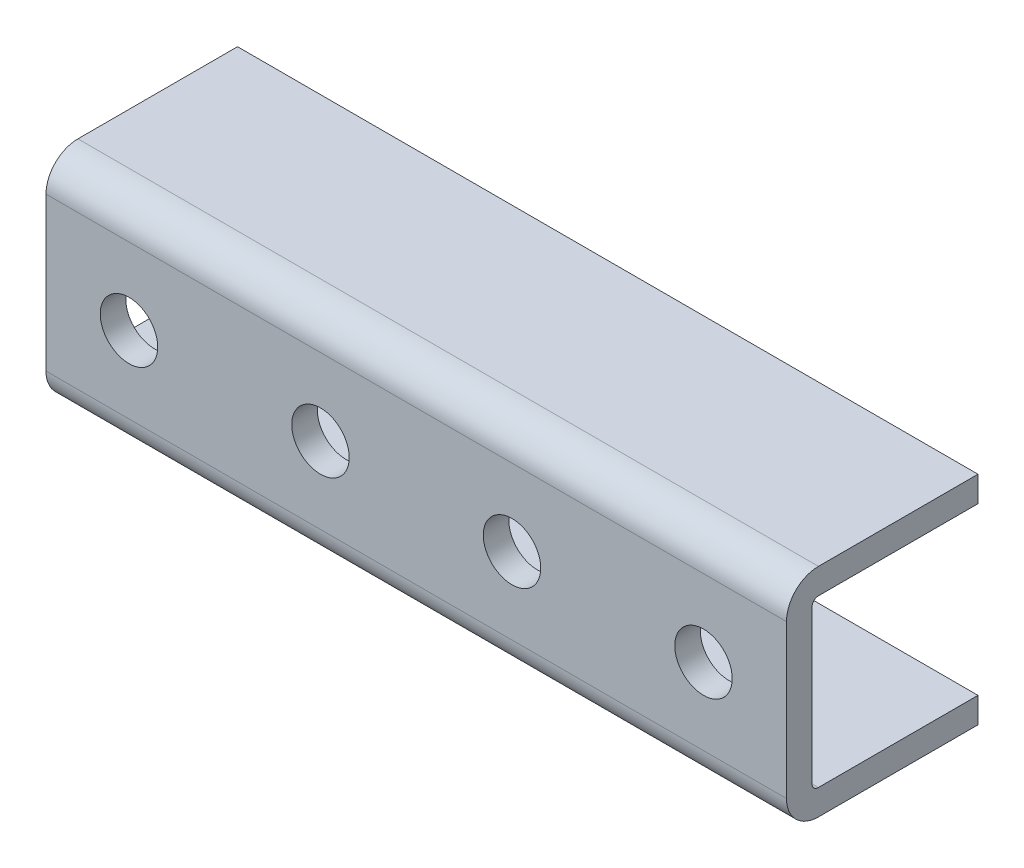
ISO-10303-21;
HEADER;
FILE_DESCRIPTION(('STEP AP214'),'2;1');
FILE_NAME('part.step','',(''),(''),'','','');
FILE_SCHEMA(('AUTOMOTIVE_DESIGN { 1 0 10303 214 1 1 1 1 }'));
ENDSEC;
DATA;
#1=APPLICATION_CONTEXT('core data for automotive mechanical design processes');
#2=APPLICATION_PROTOCOL_DEFINITION('international standard','automotive_design',2000,#1);
#3=PRODUCT_CONTEXT('',#1,'mechanical');
#4=PRODUCT('Part','Part','',(#3));
#5=PRODUCT_RELATED_PRODUCT_CATEGORY('part','',(#4));
#6=PRODUCT_DEFINITION_FORMATION('','',#4);
#7=PRODUCT_DEFINITION_CONTEXT('part definition',#1,'design');
#8=PRODUCT_DEFINITION('design','',#6,#7);
#9=PRODUCT_DEFINITION_SHAPE('','',#8);
#10=(LENGTH_UNIT() NAMED_UNIT(*) SI_UNIT(.MILLI.,.METRE.));
#11=(NAMED_UNIT(*) PLANE_ANGLE_UNIT() SI_UNIT($,.RADIAN.));
#12=(NAMED_UNIT(*) SI_UNIT($,.STERADIAN.) SOLID_ANGLE_UNIT());
#13=UNCERTAINTY_MEASURE_WITH_UNIT(LENGTH_MEASURE(1.E-05),#10,'distance_accuracy_value','');
#14=(GEOMETRIC_REPRESENTATION_CONTEXT(3) GLOBAL_UNCERTAINTY_ASSIGNED_CONTEXT((#13)) GLOBAL_UNIT_ASSIGNED_CONTEXT((#10,
#11,#12)) REPRESENTATION_CONTEXT('',''));
#15=CARTESIAN_POINT('',(0.,0.,0.));
#16=DIRECTION('',(0.,0.,1.));
#17=DIRECTION('',(1.,0.,0.));
#18=AXIS2_PLACEMENT_3D('',#15,#16,#17);
#19=CARTESIAN_POINT('',(92.075,26.9875,23.8125));
#20=DIRECTION('',(-1.,0.,0.));
#21=DIRECTION('',(0.,0.,1.));
#22=AXIS2_PLACEMENT_3D('',#19,#20,#21);
#23=PLANE('',#22);
#24=DIRECTION('',(0.,0.,-1.));
#25=VECTOR('',#24,1.);
#26=CARTESIAN_POINT('',(92.075,-20.6375,23.8125));
#27=LINE('',#26,#25);
#28=CARTESIAN_POINT('',(92.075,-20.6375,15.875));
#29=VERTEX_POINT('',#28);
#30=CARTESIAN_POINT('',(92.075,-20.6375,-23.8125));
#31=VERTEX_POINT('',#30);
#32=EDGE_CURVE('E49',#29,#31,#27,.T.);
#33=ORIENTED_EDGE('',*,*,#32,.F.);
#34=CARTESIAN_POINT('',(92.075,-19.05,15.875));
#35=DIRECTION('',(-1.,0.,0.));
#36=DIRECTION('',(0.,0.,1.));
#37=AXIS2_PLACEMENT_3D('',#34,#35,#36);
#38=CIRCLE('',#37,1.5875);
#39=CARTESIAN_POINT('',(92.075,-19.05,17.4625));
#40=VERTEX_POINT('',#39);
#41=EDGE_CURVE('E211',#40,#29,#38,.F.);
#42=ORIENTED_EDGE('',*,*,#41,.F.);
#43=DIRECTION('',(0.,1.,0.));
#44=VECTOR('',#43,1.);
#45=CARTESIAN_POINT('',(92.075,26.9875,17.4625));
#46=LINE('',#45,#44);
#47=CARTESIAN_POINT('',(92.075,19.05,17.4625));
#48=VERTEX_POINT('',#47);
#49=EDGE_CURVE('E221',#40,#48,#46,.T.);
#50=ORIENTED_EDGE('',*,*,#49,.T.);
#51=CARTESIAN_POINT('',(92.075,19.05,15.875));
#52=DIRECTION('',(-1.,0.,0.));
#53=DIRECTION('',(0.,0.,1.));
#54=AXIS2_PLACEMENT_3D('',#51,#52,#53);
#55=CIRCLE('',#54,1.5875);
#56=CARTESIAN_POINT('',(92.075,20.6375,15.875));
#57=VERTEX_POINT('',#56);
#58=EDGE_CURVE('E214',#57,#48,#55,.F.);
#59=ORIENTED_EDGE('',*,*,#58,.F.);
#60=DIRECTION('',(0.,0.,-1.));
#61=VECTOR('',#60,1.);
#62=CARTESIAN_POINT('',(92.075,20.6375,23.8125));
#63=LINE('',#62,#61);
#64=CARTESIAN_POINT('',(92.075,20.6375,-23.8125));
#65=VERTEX_POINT('',#64);
#66=EDGE_CURVE('E216',#57,#65,#63,.T.);
#67=ORIENTED_EDGE('',*,*,#66,.T.);
#68=DIRECTION('',(0.,1.,0.));
#69=VECTOR('',#68,1.);
#70=CARTESIAN_POINT('',(92.075,26.9875,-23.8125));
#71=LINE('',#70,#69);
#72=CARTESIAN_POINT('',(92.075,26.9875,-23.8125));
#73=VERTEX_POINT('',#72);
#74=EDGE_CURVE('E155',#65,#73,#71,.T.);
#75=ORIENTED_EDGE('',*,*,#74,.T.);
#76=DIRECTION('',(0.,0.,-1.));
#77=VECTOR('',#76,1.);
#78=CARTESIAN_POINT('',(92.075,26.9875,23.8125));
#79=LINE('',#78,#77);
#80=CARTESIAN_POINT('',(92.075,26.9875,15.875));
#81=VERTEX_POINT('',#80);
#82=EDGE_CURVE('E164',#81,#73,#79,.T.);
#83=ORIENTED_EDGE('',*,*,#82,.F.);
#84=CARTESIAN_POINT('',(92.075,19.05,15.875));
#85=DIRECTION('',(-1.,0.,0.));
#86=DIRECTION('',(0.,0.,1.));
#87=AXIS2_PLACEMENT_3D('',#84,#85,#86);
#88=CIRCLE('',#87,7.9375);
#89=CARTESIAN_POINT('',(92.075,19.05,23.8125));
#90=VERTEX_POINT('',#89);
#91=EDGE_CURVE('E177',#81,#90,#88,.F.);
#92=ORIENTED_EDGE('',*,*,#91,.T.);
#93=DIRECTION('',(0.,1.,0.));
#94=VECTOR('',#93,1.);
#95=CARTESIAN_POINT('',(92.075,26.9875,23.8125));
#96=LINE('',#95,#94);
#97=CARTESIAN_POINT('',(92.075,-19.05,23.8125));
#98=VERTEX_POINT('',#97);
#99=EDGE_CURVE('E152',#98,#90,#96,.T.);
#100=ORIENTED_EDGE('',*,*,#99,.F.);
#101=CARTESIAN_POINT('',(92.075,-19.05,15.875));
#102=DIRECTION('',(-1.,0.,0.));
#103=DIRECTION('',(0.,0.,1.));
#104=AXIS2_PLACEMENT_3D('',#101,#102,#103);
#105=CIRCLE('',#104,7.9375);
#106=CARTESIAN_POINT('',(92.075,-26.9875,15.875));
#107=VERTEX_POINT('',#106);
#108=EDGE_CURVE('E179',#98,#107,#105,.F.);
#109=ORIENTED_EDGE('',*,*,#108,.T.);
#110=DIRECTION('',(0.,0.,-1.));
#111=VECTOR('',#110,1.);
#112=CARTESIAN_POINT('',(92.075,-26.9875,23.8125));
#113=LINE('',#112,#111);
#114=CARTESIAN_POINT('',(92.075,-26.9875,-23.8125));
#115=VERTEX_POINT('',#114);
#116=EDGE_CURVE('E167',#107,#115,#113,.T.);
#117=ORIENTED_EDGE('',*,*,#116,.T.);
#118=EDGE_CURVE('E156',#115,#31,#71,.T.);
#119=ORIENTED_EDGE('',*,*,#118,.T.);
#120=EDGE_LOOP('',(#33,#42,#50,#59,#67,#75,#83,#92,#100,#109,#117,#119));
#121=FACE_BOUND('',#120,.T.);
#122=ADVANCED_FACE('F32',(#121),#23,.F.);
#123=CARTESIAN_POINT('',(-92.075,-26.9875,-23.8125));
#124=DIRECTION('',(0.,0.,1.));
#125=DIRECTION('',(1.,0.,0.));
#126=AXIS2_PLACEMENT_3D('',#123,#124,#125);
#127=PLANE('',#126);
#128=ORIENTED_EDGE('',*,*,#74,.F.);
#129=DIRECTION('',(-1.,0.,0.));
#130=VECTOR('',#129,1.);
#131=CARTESIAN_POINT('',(-92.075,20.6375,-23.8125));
#132=LINE('',#131,#130);
#133=CARTESIAN_POINT('',(-92.075,20.6375,-23.8125));
#134=VERTEX_POINT('',#133);
#135=EDGE_CURVE('E130',#65,#134,#132,.T.);
#136=ORIENTED_EDGE('',*,*,#135,.T.);
#137=DIRECTION('',(0.,-1.,0.));
#138=VECTOR('',#137,1.);
#139=CARTESIAN_POINT('',(-92.075,26.9875,-23.8125));
#140=LINE('',#139,#138);
#141=CARTESIAN_POINT('',(-92.075,26.9875,-23.8125));
#142=VERTEX_POINT('',#141);
#143=EDGE_CURVE('E145',#142,#134,#140,.T.);
#144=ORIENTED_EDGE('',*,*,#143,.F.);
#145=DIRECTION('',(-1.,0.,0.));
#146=VECTOR('',#145,1.);
#147=CARTESIAN_POINT('',(-92.075,26.9875,-23.8125));
#148=LINE('',#147,#146);
#149=EDGE_CURVE('E158',#73,#142,#148,.T.);
#150=ORIENTED_EDGE('',*,*,#149,.F.);
#151=EDGE_LOOP('',(#128,#136,#144,#150));
#152=FACE_BOUND('',#151,.T.);
#153=ADVANCED_FACE('F251',(#152),#127,.F.);
#154=CARTESIAN_POINT('',(-92.075,26.9875,23.8125));
#155=DIRECTION('',(1.,0.,0.));
#156=DIRECTION('',(0.,0.,-1.));
#157=AXIS2_PLACEMENT_3D('',#154,#155,#156);
#158=PLANE('',#157);
#159=CARTESIAN_POINT('',(-92.075,-19.05,15.875));
#160=DIRECTION('',(1.,0.,0.));
#161=DIRECTION('',(0.,0.,-1.));
#162=AXIS2_PLACEMENT_3D('',#159,#160,#161);
#163=CIRCLE('',#162,1.5875);
#164=CARTESIAN_POINT('',(-92.075,-20.6375,15.875));
#165=VERTEX_POINT('',#164);
#166=CARTESIAN_POINT('',(-92.075,-19.05,17.4625));
#167=VERTEX_POINT('',#166);
#168=EDGE_CURVE('E138',#165,#167,#163,.F.);
#169=ORIENTED_EDGE('',*,*,#168,.F.);
#170=DIRECTION('',(0.,0.,-1.));
#171=VECTOR('',#170,1.);
#172=CARTESIAN_POINT('',(-92.075,-20.6375,23.8125));
#173=LINE('',#172,#171);
#174=CARTESIAN_POINT('',(-92.075,-20.6375,-23.8125));
#175=VERTEX_POINT('',#174);
#176=EDGE_CURVE('E124',#165,#175,#173,.T.);
#177=ORIENTED_EDGE('',*,*,#176,.T.);
#178=CARTESIAN_POINT('',(-92.075,-26.9875,-23.8125));
#179=VERTEX_POINT('',#178);
#180=EDGE_CURVE('E135',#175,#179,#140,.T.);
#181=ORIENTED_EDGE('',*,*,#180,.T.);
#182=DIRECTION('',(0.,0.,-1.));
#183=VECTOR('',#182,1.);
#184=CARTESIAN_POINT('',(-92.075,-26.9875,23.8125));
#185=LINE('',#184,#183);
#186=CARTESIAN_POINT('',(-92.075,-26.9875,15.875));
#187=VERTEX_POINT('',#186);
#188=EDGE_CURVE('E169',#187,#179,#185,.T.);
#189=ORIENTED_EDGE('',*,*,#188,.F.);
#190=CARTESIAN_POINT('',(-92.075,-19.05,15.875));
#191=DIRECTION('',(1.,0.,0.));
#192=DIRECTION('',(0.,0.,-1.));
#193=AXIS2_PLACEMENT_3D('',#190,#191,#192);
#194=CIRCLE('',#193,7.9375);
#195=CARTESIAN_POINT('',(-92.075,-19.05,23.8125));
#196=VERTEX_POINT('',#195);
#197=EDGE_CURVE('E41',#187,#196,#194,.F.);
#198=ORIENTED_EDGE('',*,*,#197,.T.);
#199=DIRECTION('',(0.,-1.,0.));
#200=VECTOR('',#199,1.);
#201=CARTESIAN_POINT('',(-92.075,26.9875,23.8125));
#202=LINE('',#201,#200);
#203=CARTESIAN_POINT('',(-92.075,19.05,23.8125));
#204=VERTEX_POINT('',#203);
#205=EDGE_CURVE('E161',#204,#196,#202,.T.);
#206=ORIENTED_EDGE('',*,*,#205,.F.);
#207=CARTESIAN_POINT('',(-92.075,19.05,15.875));
#208=DIRECTION('',(1.,0.,0.));
#209=DIRECTION('',(0.,0.,-1.));
#210=AXIS2_PLACEMENT_3D('',#207,#208,#209);
#211=CIRCLE('',#210,7.9375);
#212=CARTESIAN_POINT('',(-92.075,26.9875,15.875));
#213=VERTEX_POINT('',#212);
#214=EDGE_CURVE('E57',#204,#213,#211,.F.);
#215=ORIENTED_EDGE('',*,*,#214,.T.);
#216=DIRECTION('',(0.,0.,-1.));
#217=VECTOR('',#216,1.);
#218=CARTESIAN_POINT('',(-92.075,26.9875,23.8125));
#219=LINE('',#218,#217);
#220=EDGE_CURVE('E162',#213,#142,#219,.T.);
#221=ORIENTED_EDGE('',*,*,#220,.T.);
#222=ORIENTED_EDGE('',*,*,#143,.T.);
#223=DIRECTION('',(0.,0.,-1.));
#224=VECTOR('',#223,1.);
#225=CARTESIAN_POINT('',(-92.075,20.6375,23.8125));
#226=LINE('',#225,#224);
#227=CARTESIAN_POINT('',(-92.075,20.6375,15.875));
#228=VERTEX_POINT('',#227);
#229=EDGE_CURVE('E223',#228,#134,#226,.T.);
#230=ORIENTED_EDGE('',*,*,#229,.F.);
#231=CARTESIAN_POINT('',(-92.075,19.05,15.875));
#232=DIRECTION('',(1.,0.,0.));
#233=DIRECTION('',(0.,0.,-1.));
#234=AXIS2_PLACEMENT_3D('',#231,#232,#233);
#235=CIRCLE('',#234,1.5875);
#236=CARTESIAN_POINT('',(-92.075,19.05,17.4625));
#237=VERTEX_POINT('',#236);
#238=EDGE_CURVE('E210',#237,#228,#235,.F.);
#239=ORIENTED_EDGE('',*,*,#238,.F.);
#240=DIRECTION('',(0.,-1.,0.));
#241=VECTOR('',#240,1.);
#242=CARTESIAN_POINT('',(-92.075,26.9875,17.4625));
#243=LINE('',#242,#241);
#244=EDGE_CURVE('E219',#237,#167,#243,.T.);
#245=ORIENTED_EDGE('',*,*,#244,.T.);
#246=EDGE_LOOP('',(#169,#177,#181,#189,#198,#206,#215,#221,#222,#230,#239,#245));
#247=FACE_BOUND('',#246,.T.);
#248=ADVANCED_FACE('F133',(#247),#158,.F.);
#249=CARTESIAN_POINT('',(-92.075,-26.9875,23.8125));
#250=DIRECTION('',(0.,1.,0.));
#251=DIRECTION('',(0.,0.,1.));
#252=AXIS2_PLACEMENT_3D('',#249,#250,#251);
#253=PLANE('',#252);
#254=ORIENTED_EDGE('',*,*,#116,.F.);
#255=DIRECTION('',(1.,0.,0.));
#256=VECTOR('',#255,1.);
#257=CARTESIAN_POINT('',(-92.075,-26.9875,15.875));
#258=LINE('',#257,#256);
#259=EDGE_CURVE('E181',#107,#187,#258,.F.);
#260=ORIENTED_EDGE('',*,*,#259,.T.);
#261=ORIENTED_EDGE('',*,*,#188,.T.);
#262=DIRECTION('',(1.,0.,0.));
#263=VECTOR('',#262,1.);
#264=CARTESIAN_POINT('',(-92.075,-26.9875,-23.8125));
#265=LINE('',#264,#263);
#266=EDGE_CURVE('E144',#179,#115,#265,.T.);
#267=ORIENTED_EDGE('',*,*,#266,.T.);
#268=EDGE_LOOP('',(#254,#260,#261,#267));
#269=FACE_BOUND('',#268,.T.);
#270=ADVANCED_FACE('F272',(#269),#253,.F.);
#271=CARTESIAN_POINT('',(-92.075,26.9875,23.8125));
#272=DIRECTION('',(0.,-1.,0.));
#273=DIRECTION('',(0.,0.,-1.));
#274=AXIS2_PLACEMENT_3D('',#271,#272,#273);
#275=PLANE('',#274);
#276=ORIENTED_EDGE('',*,*,#220,.F.);
#277=DIRECTION('',(-1.,0.,0.));
#278=VECTOR('',#277,1.);
#279=CARTESIAN_POINT('',(92.075,26.9875,15.875));
#280=LINE('',#279,#278);
#281=EDGE_CURVE('E11',#213,#81,#280,.F.);
#282=ORIENTED_EDGE('',*,*,#281,.T.);
#283=ORIENTED_EDGE('',*,*,#82,.T.);
#284=ORIENTED_EDGE('',*,*,#149,.T.);
#285=EDGE_LOOP('',(#276,#282,#283,#284));
#286=FACE_BOUND('',#285,.T.);
#287=ADVANCED_FACE('F245',(#286),#275,.F.);
#288=CARTESIAN_POINT('',(-92.075,-26.9875,23.8125));
#289=DIRECTION('',(0.,0.,1.));
#290=DIRECTION('',(1.,0.,0.));
#291=AXIS2_PLACEMENT_3D('',#288,#289,#290);
#292=PLANE('',#291);
#293=CARTESIAN_POINT('',(71.4375,0.,23.8125));
#294=DIRECTION('',(0.,0.,1.));
#295=DIRECTION('',(1.,0.,0.));
#296=AXIS2_PLACEMENT_3D('',#293,#294,#295);
#297=CIRCLE('',#296,7.14375);
#298=CARTESIAN_POINT('',(78.58125,0.,23.8125));
#299=VERTEX_POINT('',#298);
#300=EDGE_CURVE('E203',#299,#299,#297,.T.);
#301=ORIENTED_EDGE('',*,*,#300,.F.);
#302=EDGE_LOOP('',(#301));
#303=FACE_BOUND('',#302,.T.);
#304=CARTESIAN_POINT('',(23.8125,0.,23.8125));
#305=DIRECTION('',(0.,0.,1.));
#306=DIRECTION('',(1.,0.,0.));
#307=AXIS2_PLACEMENT_3D('',#304,#305,#306);
#308=CIRCLE('',#307,7.14375);
#309=CARTESIAN_POINT('',(30.95625,0.,23.8125));
#310=VERTEX_POINT('',#309);
#311=EDGE_CURVE('E193',#310,#310,#308,.T.);
#312=ORIENTED_EDGE('',*,*,#311,.F.);
#313=EDGE_LOOP('',(#312));
#314=FACE_BOUND('',#313,.T.);
#315=CARTESIAN_POINT('',(-23.8125,0.,23.8125));
#316=DIRECTION('',(0.,0.,1.));
#317=DIRECTION('',(1.,0.,0.));
#318=AXIS2_PLACEMENT_3D('',#315,#316,#317);
#319=CIRCLE('',#318,7.14375);
#320=CARTESIAN_POINT('',(-16.66875,0.,23.8125));
#321=VERTEX_POINT('',#320);
#322=EDGE_CURVE('E190',#321,#321,#319,.T.);
#323=ORIENTED_EDGE('',*,*,#322,.F.);
#324=EDGE_LOOP('',(#323));
#325=FACE_BOUND('',#324,.T.);
#326=CARTESIAN_POINT('',(-71.4375,0.,23.8125));
#327=DIRECTION('',(0.,0.,1.));
#328=DIRECTION('',(1.,0.,0.));
#329=AXIS2_PLACEMENT_3D('',#326,#327,#328);
#330=CIRCLE('',#329,7.14375);
#331=CARTESIAN_POINT('',(-64.29375,0.,23.8125));
#332=VERTEX_POINT('',#331);
#333=EDGE_CURVE('E187',#332,#332,#330,.T.);
#334=ORIENTED_EDGE('',*,*,#333,.F.);
#335=EDGE_LOOP('',(#334));
#336=FACE_BOUND('',#335,.T.);
#337=ORIENTED_EDGE('',*,*,#205,.T.);
#338=DIRECTION('',(1.,0.,0.));
#339=VECTOR('',#338,1.);
#340=CARTESIAN_POINT('',(92.075,-19.05,23.8125));
#341=LINE('',#340,#339);
#342=EDGE_CURVE('E174',#196,#98,#341,.T.);
#343=ORIENTED_EDGE('',*,*,#342,.T.);
#344=ORIENTED_EDGE('',*,*,#99,.T.);
#345=DIRECTION('',(-1.,0.,0.));
#346=VECTOR('',#345,1.);
#347=CARTESIAN_POINT('',(-92.075,19.05,23.8125));
#348=LINE('',#347,#346);
#349=EDGE_CURVE('E171',#90,#204,#348,.T.);
#350=ORIENTED_EDGE('',*,*,#349,.T.);
#351=EDGE_LOOP('',(#337,#343,#344,#350));
#352=FACE_BOUND('',#351,.T.);
#353=ADVANCED_FACE('F238',(#303,#314,#325,#336,#352),#292,.T.);
#354=ORIENTED_EDGE('',*,*,#180,.F.);
#355=DIRECTION('',(1.,0.,0.));
#356=VECTOR('',#355,1.);
#357=CARTESIAN_POINT('',(-92.075,-20.6375,-23.8125));
#358=LINE('',#357,#356);
#359=EDGE_CURVE('E121',#175,#31,#358,.T.);
#360=ORIENTED_EDGE('',*,*,#359,.T.);
#361=ORIENTED_EDGE('',*,*,#118,.F.);
#362=ORIENTED_EDGE('',*,*,#266,.F.);
#363=EDGE_LOOP('',(#354,#360,#361,#362));
#364=FACE_BOUND('',#363,.T.);
#365=ADVANCED_FACE('F142',(#364),#127,.F.);
#366=CARTESIAN_POINT('',(-92.075,-19.05,15.875));
#367=DIRECTION('',(-1.,0.,0.));
#368=DIRECTION('',(0.,0.,1.));
#369=AXIS2_PLACEMENT_3D('',#366,#367,#368);
#370=CYLINDRICAL_SURFACE('',#369,7.9375);
#371=ORIENTED_EDGE('',*,*,#197,.F.);
#372=ORIENTED_EDGE('',*,*,#259,.F.);
#373=ORIENTED_EDGE('',*,*,#108,.F.);
#374=ORIENTED_EDGE('',*,*,#342,.F.);
#375=EDGE_LOOP('',(#371,#372,#373,#374));
#376=FACE_BOUND('',#375,.T.);
#377=ADVANCED_FACE('F275',(#376),#370,.T.);
#378=CARTESIAN_POINT('',(-92.075,19.05,15.875));
#379=DIRECTION('',(1.,0.,0.));
#380=DIRECTION('',(0.,0.,-1.));
#381=AXIS2_PLACEMENT_3D('',#378,#379,#380);
#382=CYLINDRICAL_SURFACE('',#381,7.9375);
#383=ORIENTED_EDGE('',*,*,#91,.F.);
#384=ORIENTED_EDGE('',*,*,#281,.F.);
#385=ORIENTED_EDGE('',*,*,#214,.F.);
#386=ORIENTED_EDGE('',*,*,#349,.F.);
#387=EDGE_LOOP('',(#383,#384,#385,#386));
#388=FACE_BOUND('',#387,.T.);
#389=ADVANCED_FACE('F34',(#388),#382,.T.);
#390=CARTESIAN_POINT('',(-92.075,-20.6375,23.8125));
#391=DIRECTION('',(0.,1.,0.));
#392=DIRECTION('',(0.,0.,1.));
#393=AXIS2_PLACEMENT_3D('',#390,#391,#392);
#394=PLANE('',#393);
#395=ORIENTED_EDGE('',*,*,#32,.T.);
#396=ORIENTED_EDGE('',*,*,#359,.F.);
#397=ORIENTED_EDGE('',*,*,#176,.F.);
#398=DIRECTION('',(1.,0.,0.));
#399=VECTOR('',#398,1.);
#400=CARTESIAN_POINT('',(-92.075,-20.6375,15.875));
#401=LINE('',#400,#399);
#402=EDGE_CURVE('E208',#29,#165,#401,.F.);
#403=ORIENTED_EDGE('',*,*,#402,.F.);
#404=EDGE_LOOP('',(#395,#396,#397,#403));
#405=FACE_BOUND('',#404,.T.);
#406=ADVANCED_FACE('F123',(#405),#394,.T.);
#407=CARTESIAN_POINT('',(-92.075,20.6375,23.8125));
#408=DIRECTION('',(0.,-1.,0.));
#409=DIRECTION('',(0.,0.,-1.));
#410=AXIS2_PLACEMENT_3D('',#407,#408,#409);
#411=PLANE('',#410);
#412=ORIENTED_EDGE('',*,*,#229,.T.);
#413=ORIENTED_EDGE('',*,*,#135,.F.);
#414=ORIENTED_EDGE('',*,*,#66,.F.);
#415=DIRECTION('',(1.,0.,0.));
#416=VECTOR('',#415,1.);
#417=CARTESIAN_POINT('',(-92.075,20.6375,15.875));
#418=LINE('',#417,#416);
#419=EDGE_CURVE('E146',#228,#57,#418,.T.);
#420=ORIENTED_EDGE('',*,*,#419,.F.);
#421=EDGE_LOOP('',(#412,#413,#414,#420));
#422=FACE_BOUND('',#421,.T.);
#423=ADVANCED_FACE('F257',(#422),#411,.T.);
#424=CARTESIAN_POINT('',(-92.075,-26.9875,17.4625));
#425=DIRECTION('',(0.,0.,1.));
#426=DIRECTION('',(1.,0.,0.));
#427=AXIS2_PLACEMENT_3D('',#424,#425,#426);
#428=PLANE('',#427);
#429=CARTESIAN_POINT('',(71.4375,0.,17.4625));
#430=DIRECTION('',(0.,0.,1.));
#431=DIRECTION('',(1.,0.,0.));
#432=AXIS2_PLACEMENT_3D('',#429,#430,#431);
#433=CIRCLE('',#432,7.14375);
#434=CARTESIAN_POINT('',(78.58125,0.,17.4625));
#435=VERTEX_POINT('',#434);
#436=EDGE_CURVE('E36',#435,#435,#433,.T.);
#437=ORIENTED_EDGE('',*,*,#436,.T.);
#438=EDGE_LOOP('',(#437));
#439=FACE_BOUND('',#438,.T.);
#440=CARTESIAN_POINT('',(23.8125,0.,17.4625));
#441=DIRECTION('',(0.,0.,1.));
#442=DIRECTION('',(1.,0.,0.));
#443=AXIS2_PLACEMENT_3D('',#440,#441,#442);
#444=CIRCLE('',#443,7.14375);
#445=CARTESIAN_POINT('',(30.95625,0.,17.4625));
#446=VERTEX_POINT('',#445);
#447=EDGE_CURVE('E191',#446,#446,#444,.T.);
#448=ORIENTED_EDGE('',*,*,#447,.T.);
#449=EDGE_LOOP('',(#448));
#450=FACE_BOUND('',#449,.T.);
#451=CARTESIAN_POINT('',(-23.8125,0.,17.4625));
#452=DIRECTION('',(0.,0.,1.));
#453=DIRECTION('',(1.,0.,0.));
#454=AXIS2_PLACEMENT_3D('',#451,#452,#453);
#455=CIRCLE('',#454,7.14375);
#456=CARTESIAN_POINT('',(-16.66875,0.,17.4625));
#457=VERTEX_POINT('',#456);
#458=EDGE_CURVE('E188',#457,#457,#455,.T.);
#459=ORIENTED_EDGE('',*,*,#458,.T.);
#460=EDGE_LOOP('',(#459));
#461=FACE_BOUND('',#460,.T.);
#462=CARTESIAN_POINT('',(-71.4375,0.,17.4625));
#463=DIRECTION('',(0.,0.,1.));
#464=DIRECTION('',(1.,0.,0.));
#465=AXIS2_PLACEMENT_3D('',#462,#463,#464);
#466=CIRCLE('',#465,7.14375);
#467=CARTESIAN_POINT('',(-64.29375,0.,17.4625));
#468=VERTEX_POINT('',#467);
#469=EDGE_CURVE('E131',#468,#468,#466,.T.);
#470=ORIENTED_EDGE('',*,*,#469,.T.);
#471=EDGE_LOOP('',(#470));
#472=FACE_BOUND('',#471,.T.);
#473=ORIENTED_EDGE('',*,*,#244,.F.);
#474=DIRECTION('',(1.,0.,0.));
#475=VECTOR('',#474,1.);
#476=CARTESIAN_POINT('',(-92.075,19.05,17.4625));
#477=LINE('',#476,#475);
#478=EDGE_CURVE('E139',#48,#237,#477,.F.);
#479=ORIENTED_EDGE('',*,*,#478,.F.);
#480=ORIENTED_EDGE('',*,*,#49,.F.);
#481=DIRECTION('',(1.,0.,0.));
#482=VECTOR('',#481,1.);
#483=CARTESIAN_POINT('',(-92.075,-19.05,17.4625));
#484=LINE('',#483,#482);
#485=EDGE_CURVE('E212',#167,#40,#484,.T.);
#486=ORIENTED_EDGE('',*,*,#485,.F.);
#487=EDGE_LOOP('',(#473,#479,#480,#486));
#488=FACE_BOUND('',#487,.T.);
#489=ADVANCED_FACE('F265',(#439,#450,#461,#472,#488),#428,.F.);
#490=CARTESIAN_POINT('',(-92.075,-19.05,15.875));
#491=DIRECTION('',(-1.,0.,0.));
#492=DIRECTION('',(0.,0.,1.));
#493=AXIS2_PLACEMENT_3D('',#490,#491,#492);
#494=CYLINDRICAL_SURFACE('',#493,1.5875);
#495=ORIENTED_EDGE('',*,*,#168,.T.);
#496=ORIENTED_EDGE('',*,*,#485,.T.);
#497=ORIENTED_EDGE('',*,*,#41,.T.);
#498=ORIENTED_EDGE('',*,*,#402,.T.);
#499=EDGE_LOOP('',(#495,#496,#497,#498));
#500=FACE_BOUND('',#499,.T.);
#501=ADVANCED_FACE('F268',(#500),#494,.F.);
#502=CARTESIAN_POINT('',(-92.075,19.05,15.875));
#503=DIRECTION('',(1.,0.,0.));
#504=DIRECTION('',(0.,0.,-1.));
#505=AXIS2_PLACEMENT_3D('',#502,#503,#504);
#506=CYLINDRICAL_SURFACE('',#505,1.5875);
#507=ORIENTED_EDGE('',*,*,#58,.T.);
#508=ORIENTED_EDGE('',*,*,#478,.T.);
#509=ORIENTED_EDGE('',*,*,#238,.T.);
#510=ORIENTED_EDGE('',*,*,#419,.T.);
#511=EDGE_LOOP('',(#507,#508,#509,#510));
#512=FACE_BOUND('',#511,.T.);
#513=ADVANCED_FACE('F259',(#512),#506,.F.);
#514=CARTESIAN_POINT('',(-71.4375,0.,-23.8125));
#515=DIRECTION('',(0.,0.,1.));
#516=DIRECTION('',(1.,0.,0.));
#517=AXIS2_PLACEMENT_3D('',#514,#515,#516);
#518=CYLINDRICAL_SURFACE('',#517,7.14375);
#519=ORIENTED_EDGE('',*,*,#333,.T.);
#520=EDGE_LOOP('',(#519));
#521=FACE_BOUND('',#520,.T.);
#522=ORIENTED_EDGE('',*,*,#469,.F.);
#523=EDGE_LOOP('',(#522));
#524=FACE_BOUND('',#523,.T.);
#525=ADVANCED_FACE('F353',(#521,#524),#518,.F.);
#526=CARTESIAN_POINT('',(-23.8125,0.,-23.8125));
#527=DIRECTION('',(0.,0.,1.));
#528=DIRECTION('',(1.,0.,0.));
#529=AXIS2_PLACEMENT_3D('',#526,#527,#528);
#530=CYLINDRICAL_SURFACE('',#529,7.14375);
#531=ORIENTED_EDGE('',*,*,#322,.T.);
#532=EDGE_LOOP('',(#531));
#533=FACE_BOUND('',#532,.T.);
#534=ORIENTED_EDGE('',*,*,#458,.F.);
#535=EDGE_LOOP('',(#534));
#536=FACE_BOUND('',#535,.T.);
#537=ADVANCED_FACE('F363',(#533,#536),#530,.F.);
#538=CARTESIAN_POINT('',(23.8125,0.,-23.8125));
#539=DIRECTION('',(0.,0.,1.));
#540=DIRECTION('',(1.,0.,0.));
#541=AXIS2_PLACEMENT_3D('',#538,#539,#540);
#542=CYLINDRICAL_SURFACE('',#541,7.14375);
#543=ORIENTED_EDGE('',*,*,#311,.T.);
#544=EDGE_LOOP('',(#543));
#545=FACE_BOUND('',#544,.T.);
#546=ORIENTED_EDGE('',*,*,#447,.F.);
#547=EDGE_LOOP('',(#546));
#548=FACE_BOUND('',#547,.T.);
#549=ADVANCED_FACE('F370',(#545,#548),#542,.F.);
#550=CARTESIAN_POINT('',(71.4375,0.,-23.8125));
#551=DIRECTION('',(0.,0.,1.));
#552=DIRECTION('',(1.,0.,0.));
#553=AXIS2_PLACEMENT_3D('',#550,#551,#552);
#554=CYLINDRICAL_SURFACE('',#553,7.14375);
#555=ORIENTED_EDGE('',*,*,#300,.T.);
#556=EDGE_LOOP('',(#555));
#557=FACE_BOUND('',#556,.T.);
#558=ORIENTED_EDGE('',*,*,#436,.F.);
#559=EDGE_LOOP('',(#558));
#560=FACE_BOUND('',#559,.T.);
#561=ADVANCED_FACE('F378',(#557,#560),#554,.F.);
#562=CLOSED_SHELL('',(#122,#153,#248,#270,#287,#353,#365,#377,#389,#406,#423,#489,#501,#513,
#525,#537,#549,#561));
#563=MANIFOLD_SOLID_BREP('B2',#562);
#564=ADVANCED_BREP_SHAPE_REPRESENTATION('',(#18,#563),#14);
#565=SHAPE_DEFINITION_REPRESENTATION(#9,#564);
ENDSEC;
END-ISO-10303-21;
